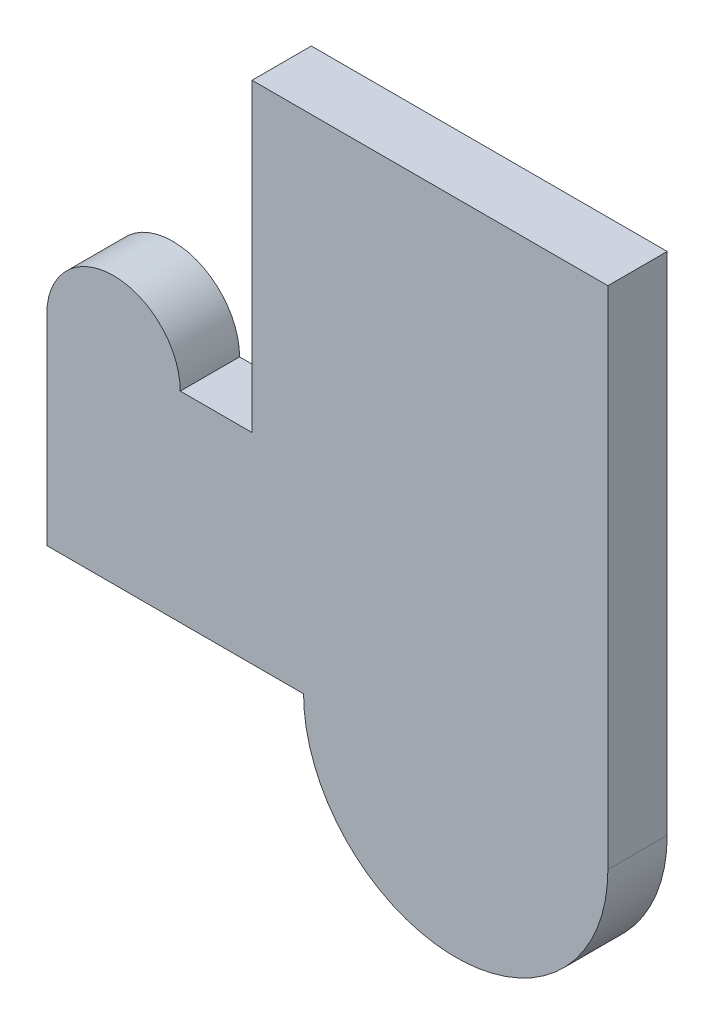
ISO-10303-21;
HEADER;
FILE_DESCRIPTION(('STEP AP214'),'2;1');
FILE_NAME('part.step','',(''),(''),'','','');
FILE_SCHEMA(('AUTOMOTIVE_DESIGN { 1 0 10303 214 1 1 1 1 }'));
ENDSEC;
DATA;
#1=APPLICATION_CONTEXT('core data for automotive mechanical design processes');
#2=APPLICATION_PROTOCOL_DEFINITION('international standard','automotive_design',2000,#1);
#3=PRODUCT_CONTEXT('',#1,'mechanical');
#4=PRODUCT('Part','Part','',(#3));
#5=PRODUCT_RELATED_PRODUCT_CATEGORY('part','',(#4));
#6=PRODUCT_DEFINITION_FORMATION('','',#4);
#7=PRODUCT_DEFINITION_CONTEXT('part definition',#1,'design');
#8=PRODUCT_DEFINITION('design','',#6,#7);
#9=PRODUCT_DEFINITION_SHAPE('','',#8);
#10=(LENGTH_UNIT() NAMED_UNIT(*) SI_UNIT(.MILLI.,.METRE.));
#11=(NAMED_UNIT(*) PLANE_ANGLE_UNIT() SI_UNIT($,.RADIAN.));
#12=(NAMED_UNIT(*) SI_UNIT($,.STERADIAN.) SOLID_ANGLE_UNIT());
#13=UNCERTAINTY_MEASURE_WITH_UNIT(LENGTH_MEASURE(1.E-05),#10,'distance_accuracy_value','');
#14=(GEOMETRIC_REPRESENTATION_CONTEXT(3) GLOBAL_UNCERTAINTY_ASSIGNED_CONTEXT((#13)) GLOBAL_UNIT_ASSIGNED_CONTEXT((#10,
#11,#12)) REPRESENTATION_CONTEXT('',''));
#15=CARTESIAN_POINT('',(0.,0.,0.));
#16=DIRECTION('',(0.,0.,1.));
#17=DIRECTION('',(1.,0.,0.));
#18=AXIS2_PLACEMENT_3D('',#15,#16,#17);
#19=CARTESIAN_POINT('',(-12.1004873612362,0.,10.));
#20=DIRECTION('',(0.,-1.,0.));
#21=DIRECTION('',(1.,0.,0.));
#22=AXIS2_PLACEMENT_3D('',#19,#20,#21);
#23=PLANE('',#22);
#24=DIRECTION('',(-1.,0.,0.));
#25=VECTOR('',#24,1.);
#26=CARTESIAN_POINT('',(-12.1004873612362,0.,0.));
#27=LINE('',#26,#25);
#28=CARTESIAN_POINT('',(0.,0.,0.));
#29=VERTEX_POINT('',#28);
#30=CARTESIAN_POINT('',(-12.1004873612363,0.,0.));
#31=VERTEX_POINT('',#30);
#32=EDGE_CURVE('E133',#29,#31,#27,.T.);
#33=ORIENTED_EDGE('',*,*,#32,.T.);
#34=DIRECTION('',(0.,0.,-1.));
#35=VECTOR('',#34,1.);
#36=CARTESIAN_POINT('',(-12.1004873612363,0.,10.));
#37=LINE('',#36,#35);
#38=CARTESIAN_POINT('',(-12.1004873612363,0.,10.));
#39=VERTEX_POINT('',#38);
#40=EDGE_CURVE('E11',#39,#31,#37,.T.);
#41=ORIENTED_EDGE('',*,*,#40,.F.);
#42=DIRECTION('',(-1.,0.,0.));
#43=VECTOR('',#42,1.);
#44=CARTESIAN_POINT('',(-12.1004873612362,0.,10.));
#45=LINE('',#44,#43);
#46=CARTESIAN_POINT('',(0.,0.,10.));
#47=VERTEX_POINT('',#46);
#48=EDGE_CURVE('E147',#47,#39,#45,.T.);
#49=ORIENTED_EDGE('',*,*,#48,.F.);
#50=DIRECTION('',(0.,0.,-1.));
#51=VECTOR('',#50,1.);
#52=CARTESIAN_POINT('',(0.,0.,10.));
#53=LINE('',#52,#51);
#54=EDGE_CURVE('E129',#47,#29,#53,.T.);
#55=ORIENTED_EDGE('',*,*,#54,.T.);
#56=EDGE_LOOP('',(#33,#41,#49,#55));
#57=FACE_BOUND('',#56,.T.);
#58=ADVANCED_FACE('F37',(#57),#23,.F.);
#59=CARTESIAN_POINT('',(-23.3511149612362,0.,10.));
#60=DIRECTION('',(0.,0.,-1.));
#61=DIRECTION('',(-1.,0.,0.));
#62=AXIS2_PLACEMENT_3D('',#59,#60,#61);
#63=CYLINDRICAL_SURFACE('',#62,11.2506276);
#64=CARTESIAN_POINT('',(-23.3511149612362,0.,0.));
#65=DIRECTION('',(0.,0.,1.));
#66=DIRECTION('',(-1.,0.,0.));
#67=AXIS2_PLACEMENT_3D('',#64,#65,#66);
#68=CIRCLE('',#67,11.2506276);
#69=CARTESIAN_POINT('',(-34.6017425612362,0.,0.));
#70=VERTEX_POINT('',#69);
#71=EDGE_CURVE('E136',#31,#70,#68,.T.);
#72=ORIENTED_EDGE('',*,*,#71,.T.);
#73=DIRECTION('',(0.,0.,-1.));
#74=VECTOR('',#73,1.);
#75=CARTESIAN_POINT('',(-34.6017425612362,0.,10.));
#76=LINE('',#75,#74);
#77=CARTESIAN_POINT('',(-34.6017425612362,0.,10.));
#78=VERTEX_POINT('',#77);
#79=EDGE_CURVE('E45',#78,#70,#76,.T.);
#80=ORIENTED_EDGE('',*,*,#79,.F.);
#81=CARTESIAN_POINT('',(-23.3511149612362,0.,10.));
#82=DIRECTION('',(0.,0.,1.));
#83=DIRECTION('',(-1.,0.,0.));
#84=AXIS2_PLACEMENT_3D('',#81,#82,#83);
#85=CIRCLE('',#84,11.2506276);
#86=EDGE_CURVE('E96',#39,#78,#85,.T.);
#87=ORIENTED_EDGE('',*,*,#86,.F.);
#88=ORIENTED_EDGE('',*,*,#40,.T.);
#89=EDGE_LOOP('',(#72,#80,#87,#88));
#90=FACE_BOUND('',#89,.T.);
#91=ADVANCED_FACE('F182',(#90),#63,.T.);
#92=CARTESIAN_POINT('',(-34.6017425612363,-33.805424954792,10.));
#93=DIRECTION('',(1.,0.,0.));
#94=DIRECTION('',(0.,1.,0.));
#95=AXIS2_PLACEMENT_3D('',#92,#93,#94);
#96=PLANE('',#95);
#97=DIRECTION('',(0.,-1.,0.));
#98=VECTOR('',#97,1.);
#99=CARTESIAN_POINT('',(-34.6017425612363,-33.805424954792,0.));
#100=LINE('',#99,#98);
#101=CARTESIAN_POINT('',(-34.6017425612363,-33.805424954792,0.));
#102=VERTEX_POINT('',#101);
#103=EDGE_CURVE('E138',#70,#102,#100,.T.);
#104=ORIENTED_EDGE('',*,*,#103,.T.);
#105=DIRECTION('',(0.,0.,-1.));
#106=VECTOR('',#105,1.);
#107=CARTESIAN_POINT('',(-34.6017425612363,-33.805424954792,10.));
#108=LINE('',#107,#106);
#109=CARTESIAN_POINT('',(-34.6017425612363,-33.805424954792,10.));
#110=VERTEX_POINT('',#109);
#111=EDGE_CURVE('E154',#110,#102,#108,.T.);
#112=ORIENTED_EDGE('',*,*,#111,.F.);
#113=DIRECTION('',(0.,-1.,0.));
#114=VECTOR('',#113,1.);
#115=CARTESIAN_POINT('',(-34.6017425612363,-33.805424954792,10.));
#116=LINE('',#115,#114);
#117=EDGE_CURVE('E162',#78,#110,#116,.T.);
#118=ORIENTED_EDGE('',*,*,#117,.F.);
#119=ORIENTED_EDGE('',*,*,#79,.T.);
#120=EDGE_LOOP('',(#104,#112,#118,#119));
#121=FACE_BOUND('',#120,.T.);
#122=ADVANCED_FACE('F160',(#121),#96,.F.);
#123=CARTESIAN_POINT('',(8.69058030577013,-33.805424954792,10.));
#124=DIRECTION('',(0.,1.,0.));
#125=DIRECTION('',(0.,0.,1.));
#126=AXIS2_PLACEMENT_3D('',#123,#124,#125);
#127=PLANE('',#126);
#128=DIRECTION('',(1.,0.,0.));
#129=VECTOR('',#128,1.);
#130=CARTESIAN_POINT('',(8.69058030577013,-33.805424954792,0.));
#131=LINE('',#130,#129);
#132=CARTESIAN_POINT('',(8.69058030577012,-33.805424954792,0.));
#133=VERTEX_POINT('',#132);
#134=EDGE_CURVE('E140',#102,#133,#131,.T.);
#135=ORIENTED_EDGE('',*,*,#134,.T.);
#136=DIRECTION('',(0.,0.,-1.));
#137=VECTOR('',#136,1.);
#138=CARTESIAN_POINT('',(8.69058030577012,-33.805424954792,10.));
#139=LINE('',#138,#137);
#140=CARTESIAN_POINT('',(8.69058030577012,-33.805424954792,10.));
#141=VERTEX_POINT('',#140);
#142=EDGE_CURVE('E151',#141,#133,#139,.T.);
#143=ORIENTED_EDGE('',*,*,#142,.F.);
#144=DIRECTION('',(1.,0.,0.));
#145=VECTOR('',#144,1.);
#146=CARTESIAN_POINT('',(8.69058030577013,-33.805424954792,10.));
#147=LINE('',#146,#145);
#148=EDGE_CURVE('E174',#110,#141,#147,.T.);
#149=ORIENTED_EDGE('',*,*,#148,.F.);
#150=ORIENTED_EDGE('',*,*,#111,.T.);
#151=EDGE_LOOP('',(#135,#143,#149,#150));
#152=FACE_BOUND('',#151,.T.);
#153=ADVANCED_FACE('F170',(#152),#127,.F.);
#154=CARTESIAN_POINT('',(34.3452901528851,-33.805424954792,10.));
#155=DIRECTION('',(0.,0.,-1.));
#156=DIRECTION('',(-1.,0.,0.));
#157=AXIS2_PLACEMENT_3D('',#154,#155,#156);
#158=CYLINDRICAL_SURFACE('',#157,25.6547098471149);
#159=CARTESIAN_POINT('',(34.3452901528851,-33.805424954792,0.));
#160=DIRECTION('',(0.,0.,1.));
#161=DIRECTION('',(-1.,0.,0.));
#162=AXIS2_PLACEMENT_3D('',#159,#160,#161);
#163=CIRCLE('',#162,25.6547098471149);
#164=CARTESIAN_POINT('',(60.,-33.8054249547921,0.));
#165=VERTEX_POINT('',#164);
#166=EDGE_CURVE('E142',#133,#165,#163,.T.);
#167=ORIENTED_EDGE('',*,*,#166,.T.);
#168=DIRECTION('',(0.,0.,-1.));
#169=VECTOR('',#168,1.);
#170=CARTESIAN_POINT('',(60.,-33.8054249547921,10.));
#171=LINE('',#170,#169);
#172=CARTESIAN_POINT('',(60.,-33.8054249547921,10.));
#173=VERTEX_POINT('',#172);
#174=EDGE_CURVE('E124',#173,#165,#171,.T.);
#175=ORIENTED_EDGE('',*,*,#174,.F.);
#176=CARTESIAN_POINT('',(34.3452901528851,-33.805424954792,10.));
#177=DIRECTION('',(0.,0.,1.));
#178=DIRECTION('',(-1.,0.,0.));
#179=AXIS2_PLACEMENT_3D('',#176,#177,#178);
#180=CIRCLE('',#179,25.6547098471149);
#181=EDGE_CURVE('E115',#141,#173,#180,.T.);
#182=ORIENTED_EDGE('',*,*,#181,.F.);
#183=ORIENTED_EDGE('',*,*,#142,.T.);
#184=EDGE_LOOP('',(#167,#175,#182,#183));
#185=FACE_BOUND('',#184,.T.);
#186=ADVANCED_FACE('F173',(#185),#158,.T.);
#187=CARTESIAN_POINT('',(60.,51.4430379746835,10.));
#188=DIRECTION('',(-1.,0.,0.));
#189=DIRECTION('',(0.,-1.,0.));
#190=AXIS2_PLACEMENT_3D('',#187,#188,#189);
#191=PLANE('',#190);
#192=DIRECTION('',(0.,1.,0.));
#193=VECTOR('',#192,1.);
#194=CARTESIAN_POINT('',(60.,51.4430379746835,0.));
#195=LINE('',#194,#193);
#196=CARTESIAN_POINT('',(60.,51.4430379746835,0.));
#197=VERTEX_POINT('',#196);
#198=EDGE_CURVE('E123',#165,#197,#195,.T.);
#199=ORIENTED_EDGE('',*,*,#198,.T.);
#200=DIRECTION('',(0.,0.,-1.));
#201=VECTOR('',#200,1.);
#202=CARTESIAN_POINT('',(60.,51.4430379746835,10.));
#203=LINE('',#202,#201);
#204=CARTESIAN_POINT('',(60.,51.4430379746835,10.));
#205=VERTEX_POINT('',#204);
#206=EDGE_CURVE('E120',#205,#197,#203,.T.);
#207=ORIENTED_EDGE('',*,*,#206,.F.);
#208=DIRECTION('',(0.,1.,0.));
#209=VECTOR('',#208,1.);
#210=CARTESIAN_POINT('',(60.,51.4430379746835,10.));
#211=LINE('',#210,#209);
#212=EDGE_CURVE('E109',#173,#205,#211,.T.);
#213=ORIENTED_EDGE('',*,*,#212,.F.);
#214=ORIENTED_EDGE('',*,*,#174,.T.);
#215=EDGE_LOOP('',(#199,#207,#213,#214));
#216=FACE_BOUND('',#215,.T.);
#217=ADVANCED_FACE('F121',(#216),#191,.F.);
#218=CARTESIAN_POINT('',(0.,51.4430379746835,10.));
#219=DIRECTION('',(0.,-1.,0.));
#220=DIRECTION('',(1.,0.,0.));
#221=AXIS2_PLACEMENT_3D('',#218,#219,#220);
#222=PLANE('',#221);
#223=DIRECTION('',(-1.,0.,0.));
#224=VECTOR('',#223,1.);
#225=CARTESIAN_POINT('',(0.,51.4430379746835,0.));
#226=LINE('',#225,#224);
#227=CARTESIAN_POINT('',(0.,51.4430379746835,0.));
#228=VERTEX_POINT('',#227);
#229=EDGE_CURVE('E82',#197,#228,#226,.T.);
#230=ORIENTED_EDGE('',*,*,#229,.T.);
#231=DIRECTION('',(0.,0.,-1.));
#232=VECTOR('',#231,1.);
#233=CARTESIAN_POINT('',(0.,51.4430379746835,10.));
#234=LINE('',#233,#232);
#235=CARTESIAN_POINT('',(0.,51.4430379746835,10.));
#236=VERTEX_POINT('',#235);
#237=EDGE_CURVE('E125',#236,#228,#234,.T.);
#238=ORIENTED_EDGE('',*,*,#237,.F.);
#239=DIRECTION('',(-1.,0.,0.));
#240=VECTOR('',#239,1.);
#241=CARTESIAN_POINT('',(0.,51.4430379746835,10.));
#242=LINE('',#241,#240);
#243=EDGE_CURVE('E113',#205,#236,#242,.T.);
#244=ORIENTED_EDGE('',*,*,#243,.F.);
#245=ORIENTED_EDGE('',*,*,#206,.T.);
#246=EDGE_LOOP('',(#230,#238,#244,#245));
#247=FACE_BOUND('',#246,.T.);
#248=ADVANCED_FACE('F127',(#247),#222,.F.);
#249=CARTESIAN_POINT('',(0.,0.,10.));
#250=DIRECTION('',(1.,0.,0.));
#251=DIRECTION('',(0.,0.,-1.));
#252=AXIS2_PLACEMENT_3D('',#249,#250,#251);
#253=PLANE('',#252);
#254=DIRECTION('',(0.,-1.,0.));
#255=VECTOR('',#254,1.);
#256=CARTESIAN_POINT('',(0.,0.,0.));
#257=LINE('',#256,#255);
#258=EDGE_CURVE('E88',#228,#29,#257,.T.);
#259=ORIENTED_EDGE('',*,*,#258,.T.);
#260=ORIENTED_EDGE('',*,*,#54,.F.);
#261=DIRECTION('',(0.,-1.,0.));
#262=VECTOR('',#261,1.);
#263=CARTESIAN_POINT('',(0.,0.,10.));
#264=LINE('',#263,#262);
#265=EDGE_CURVE('E53',#236,#47,#264,.T.);
#266=ORIENTED_EDGE('',*,*,#265,.F.);
#267=ORIENTED_EDGE('',*,*,#237,.T.);
#268=EDGE_LOOP('',(#259,#260,#266,#267));
#269=FACE_BOUND('',#268,.T.);
#270=ADVANCED_FACE('F198',(#269),#253,.F.);
#271=CARTESIAN_POINT('',(34.3452901528851,-33.805424954792,10.));
#272=DIRECTION('',(0.,0.,-1.));
#273=DIRECTION('',(-1.,0.,0.));
#274=AXIS2_PLACEMENT_3D('',#271,#272,#273);
#275=PLANE('',#274);
#276=ORIENTED_EDGE('',*,*,#48,.T.);
#277=ORIENTED_EDGE('',*,*,#86,.T.);
#278=ORIENTED_EDGE('',*,*,#117,.T.);
#279=ORIENTED_EDGE('',*,*,#148,.T.);
#280=ORIENTED_EDGE('',*,*,#181,.T.);
#281=ORIENTED_EDGE('',*,*,#212,.T.);
#282=ORIENTED_EDGE('',*,*,#243,.T.);
#283=ORIENTED_EDGE('',*,*,#265,.T.);
#284=EDGE_LOOP('',(#276,#277,#278,#279,#280,#281,#282,#283));
#285=FACE_BOUND('',#284,.T.);
#286=ADVANCED_FACE('F111',(#285),#275,.F.);
#287=CARTESIAN_POINT('',(34.3452901528851,-33.805424954792,0.));
#288=DIRECTION('',(0.,0.,-1.));
#289=DIRECTION('',(-1.,0.,0.));
#290=AXIS2_PLACEMENT_3D('',#287,#288,#289);
#291=PLANE('',#290);
#292=ORIENTED_EDGE('',*,*,#32,.F.);
#293=ORIENTED_EDGE('',*,*,#258,.F.);
#294=ORIENTED_EDGE('',*,*,#229,.F.);
#295=ORIENTED_EDGE('',*,*,#198,.F.);
#296=ORIENTED_EDGE('',*,*,#166,.F.);
#297=ORIENTED_EDGE('',*,*,#134,.F.);
#298=ORIENTED_EDGE('',*,*,#103,.F.);
#299=ORIENTED_EDGE('',*,*,#71,.F.);
#300=EDGE_LOOP('',(#292,#293,#294,#295,#296,#297,#298,#299));
#301=FACE_BOUND('',#300,.T.);
#302=ADVANCED_FACE('F166',(#301),#291,.T.);
#303=CLOSED_SHELL('',(#58,#91,#122,#153,#186,#217,#248,#270,#286,#302));
#304=MANIFOLD_SOLID_BREP('B2',#303);
#305=ADVANCED_BREP_SHAPE_REPRESENTATION('',(#18,#304),#14);
#306=SHAPE_DEFINITION_REPRESENTATION(#9,#305);
ENDSEC;
END-ISO-10303-21;
